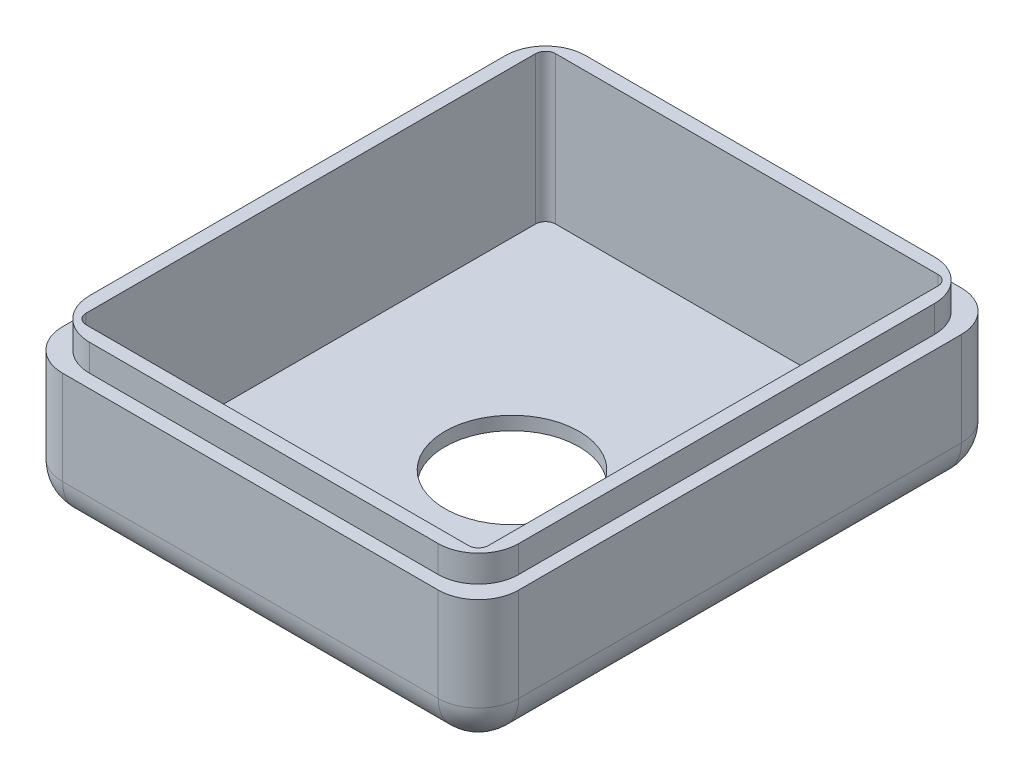
ISO-10303-21;
HEADER;
FILE_DESCRIPTION(('STEP AP214'),'2;1');
FILE_NAME('part.step','',(''),(''),'','','');
FILE_SCHEMA(('AUTOMOTIVE_DESIGN { 1 0 10303 214 1 1 1 1 }'));
ENDSEC;
DATA;
#1=APPLICATION_CONTEXT('core data for automotive mechanical design processes');
#2=APPLICATION_PROTOCOL_DEFINITION('international standard','automotive_design',2000,#1);
#3=PRODUCT_CONTEXT('',#1,'mechanical');
#4=PRODUCT('Part','Part','',(#3));
#5=PRODUCT_RELATED_PRODUCT_CATEGORY('part','',(#4));
#6=PRODUCT_DEFINITION_FORMATION('','',#4);
#7=PRODUCT_DEFINITION_CONTEXT('part definition',#1,'design');
#8=PRODUCT_DEFINITION('design','',#6,#7);
#9=PRODUCT_DEFINITION_SHAPE('','',#8);
#10=(LENGTH_UNIT() NAMED_UNIT(*) SI_UNIT(.MILLI.,.METRE.));
#11=(NAMED_UNIT(*) PLANE_ANGLE_UNIT() SI_UNIT($,.RADIAN.));
#12=(NAMED_UNIT(*) SI_UNIT($,.STERADIAN.) SOLID_ANGLE_UNIT());
#13=UNCERTAINTY_MEASURE_WITH_UNIT(LENGTH_MEASURE(1.E-05),#10,'distance_accuracy_value','');
#14=(GEOMETRIC_REPRESENTATION_CONTEXT(3) GLOBAL_UNCERTAINTY_ASSIGNED_CONTEXT((#13)) GLOBAL_UNIT_ASSIGNED_CONTEXT((#10,
#11,#12)) REPRESENTATION_CONTEXT('',''));
#15=CARTESIAN_POINT('',(0.,0.,0.));
#16=DIRECTION('',(0.,0.,1.));
#17=DIRECTION('',(1.,0.,0.));
#18=AXIS2_PLACEMENT_3D('',#15,#16,#17);
#19=CARTESIAN_POINT('',(0.,10.,0.));
#20=DIRECTION('',(0.,1.,0.));
#21=DIRECTION('',(0.,0.,1.));
#22=AXIS2_PLACEMENT_3D('',#19,#20,#21);
#23=PLANE('',#22);
#24=DIRECTION('',(0.,0.,1.));
#25=VECTOR('',#24,1.);
#26=CARTESIAN_POINT('',(-33.3060071716871,10.,-9.81740921165118));
#27=LINE('',#26,#25);
#28=CARTESIAN_POINT('',(-33.3060071716871,10.,-6.81740921165118));
#29=VERTEX_POINT('',#28);
#30=CARTESIAN_POINT('',(-33.3060071716871,10.,26.1825907883488));
#31=VERTEX_POINT('',#30);
#32=EDGE_CURVE('E246',#29,#31,#27,.T.);
#33=ORIENTED_EDGE('',*,*,#32,.T.);
#34=CARTESIAN_POINT('',(-30.3060071716871,10.,26.1825907883488));
#35=DIRECTION('',(0.,1.,0.));
#36=DIRECTION('',(0.,0.,1.));
#37=AXIS2_PLACEMENT_3D('',#34,#35,#36);
#38=CIRCLE('',#37,3.);
#39=CARTESIAN_POINT('',(-30.3060071716871,10.,29.1825907883488));
#40=VERTEX_POINT('',#39);
#41=EDGE_CURVE('E220',#31,#40,#38,.T.);
#42=ORIENTED_EDGE('',*,*,#41,.T.);
#43=DIRECTION('',(1.,0.,0.));
#44=VECTOR('',#43,1.);
#45=CARTESIAN_POINT('',(-33.3060071716871,10.,29.1825907883488));
#46=LINE('',#45,#44);
#47=CARTESIAN_POINT('',(-2.30600717168713,10.,29.1825907883488));
#48=VERTEX_POINT('',#47);
#49=EDGE_CURVE('E249',#40,#48,#46,.T.);
#50=ORIENTED_EDGE('',*,*,#49,.T.);
#51=CARTESIAN_POINT('',(-2.30600717168713,10.,26.1825907883488));
#52=DIRECTION('',(0.,1.,0.));
#53=DIRECTION('',(0.,0.,1.));
#54=AXIS2_PLACEMENT_3D('',#51,#52,#53);
#55=CIRCLE('',#54,3.);
#56=CARTESIAN_POINT('',(0.693992828312874,10.,26.1825907883488));
#57=VERTEX_POINT('',#56);
#58=EDGE_CURVE('E318',#48,#57,#55,.T.);
#59=ORIENTED_EDGE('',*,*,#58,.T.);
#60=DIRECTION('',(0.,0.,-1.));
#61=VECTOR('',#60,1.);
#62=CARTESIAN_POINT('',(0.693992828312867,10.,-9.81740921165118));
#63=LINE('',#62,#61);
#64=CARTESIAN_POINT('',(0.693992828312868,10.,-6.81740921165118));
#65=VERTEX_POINT('',#64);
#66=EDGE_CURVE('E252',#57,#65,#63,.T.);
#67=ORIENTED_EDGE('',*,*,#66,.T.);
#68=CARTESIAN_POINT('',(-2.30600717168713,10.,-6.81740921165118));
#69=DIRECTION('',(0.,1.,0.));
#70=DIRECTION('',(0.,0.,1.));
#71=AXIS2_PLACEMENT_3D('',#68,#69,#70);
#72=CIRCLE('',#71,3.);
#73=CARTESIAN_POINT('',(-2.30600717168713,10.,-9.81740921165118));
#74=VERTEX_POINT('',#73);
#75=EDGE_CURVE('E314',#65,#74,#72,.T.);
#76=ORIENTED_EDGE('',*,*,#75,.T.);
#77=DIRECTION('',(-1.,0.,0.));
#78=VECTOR('',#77,1.);
#79=CARTESIAN_POINT('',(-33.3060071716871,10.,-9.81740921165118));
#80=LINE('',#79,#78);
#81=CARTESIAN_POINT('',(-30.3060071716871,10.,-9.81740921165118));
#82=VERTEX_POINT('',#81);
#83=EDGE_CURVE('E255',#74,#82,#80,.T.);
#84=ORIENTED_EDGE('',*,*,#83,.T.);
#85=CARTESIAN_POINT('',(-30.3060071716871,10.,-6.81740921165118));
#86=DIRECTION('',(0.,1.,0.));
#87=DIRECTION('',(0.,0.,1.));
#88=AXIS2_PLACEMENT_3D('',#85,#86,#87);
#89=CIRCLE('',#88,3.);
#90=EDGE_CURVE('E316',#82,#29,#89,.T.);
#91=ORIENTED_EDGE('',*,*,#90,.T.);
#92=EDGE_LOOP('',(#33,#42,#50,#59,#67,#76,#84,#91));
#93=FACE_BOUND('',#92,.T.);
#94=DIRECTION('',(1.,0.,0.));
#95=VECTOR('',#94,1.);
#96=CARTESIAN_POINT('',(-32.3060071716871,10.,28.1825907883488));
#97=LINE('',#96,#95);
#98=CARTESIAN_POINT('',(-29.3060071716871,10.,28.1825907883488));
#99=VERTEX_POINT('',#98);
#100=CARTESIAN_POINT('',(-3.30600717168713,10.,28.1825907883488));
#101=VERTEX_POINT('',#100);
#102=EDGE_CURVE('E242',#99,#101,#97,.T.);
#103=ORIENTED_EDGE('',*,*,#102,.F.);
#104=CARTESIAN_POINT('',(-29.3060071716871,10.,25.1825907883488));
#105=DIRECTION('',(0.,1.,0.));
#106=DIRECTION('',(0.,0.,1.));
#107=AXIS2_PLACEMENT_3D('',#104,#105,#106);
#108=CIRCLE('',#107,3.);
#109=CARTESIAN_POINT('',(-32.3060071716871,10.,25.1825907883488));
#110=VERTEX_POINT('',#109);
#111=EDGE_CURVE('E322',#99,#110,#108,.F.);
#112=ORIENTED_EDGE('',*,*,#111,.T.);
#113=DIRECTION('',(0.,0.,1.));
#114=VECTOR('',#113,1.);
#115=CARTESIAN_POINT('',(-32.3060071716871,10.,28.1825907883488));
#116=LINE('',#115,#114);
#117=CARTESIAN_POINT('',(-32.3060071716871,10.,-5.81740921165118));
#118=VERTEX_POINT('',#117);
#119=EDGE_CURVE('E420',#118,#110,#116,.T.);
#120=ORIENTED_EDGE('',*,*,#119,.F.);
#121=CARTESIAN_POINT('',(-29.3060071716871,10.,-5.81740921165118));
#122=DIRECTION('',(0.,1.,0.));
#123=DIRECTION('',(0.,0.,1.));
#124=AXIS2_PLACEMENT_3D('',#121,#122,#123);
#125=CIRCLE('',#124,3.);
#126=CARTESIAN_POINT('',(-29.3060071716871,10.,-8.81740921165118));
#127=VERTEX_POINT('',#126);
#128=EDGE_CURVE('E235',#118,#127,#125,.F.);
#129=ORIENTED_EDGE('',*,*,#128,.T.);
#130=DIRECTION('',(-1.,0.,0.));
#131=VECTOR('',#130,1.);
#132=CARTESIAN_POINT('',(-32.3060071716871,10.,-8.81740921165118));
#133=LINE('',#132,#131);
#134=CARTESIAN_POINT('',(-3.30600717168713,10.,-8.81740921165118));
#135=VERTEX_POINT('',#134);
#136=EDGE_CURVE('E226',#135,#127,#133,.T.);
#137=ORIENTED_EDGE('',*,*,#136,.F.);
#138=CARTESIAN_POINT('',(-3.30600717168713,10.,-5.81740921165118));
#139=DIRECTION('',(0.,1.,0.));
#140=DIRECTION('',(0.,0.,1.));
#141=AXIS2_PLACEMENT_3D('',#138,#139,#140);
#142=CIRCLE('',#141,3.);
#143=CARTESIAN_POINT('',(-0.306007171687134,10.,-5.81740921165118));
#144=VERTEX_POINT('',#143);
#145=EDGE_CURVE('E209',#135,#144,#142,.F.);
#146=ORIENTED_EDGE('',*,*,#145,.T.);
#147=DIRECTION('',(0.,0.,-1.));
#148=VECTOR('',#147,1.);
#149=CARTESIAN_POINT('',(-0.306007171687134,10.,28.1825907883488));
#150=LINE('',#149,#148);
#151=CARTESIAN_POINT('',(-0.306007171687134,10.,25.1825907883488));
#152=VERTEX_POINT('',#151);
#153=EDGE_CURVE('E237',#152,#144,#150,.T.);
#154=ORIENTED_EDGE('',*,*,#153,.F.);
#155=CARTESIAN_POINT('',(-3.30600717168713,10.,25.1825907883488));
#156=DIRECTION('',(0.,1.,0.));
#157=DIRECTION('',(0.,0.,1.));
#158=AXIS2_PLACEMENT_3D('',#155,#156,#157);
#159=CIRCLE('',#158,3.);
#160=EDGE_CURVE('E219',#152,#101,#159,.F.);
#161=ORIENTED_EDGE('',*,*,#160,.T.);
#162=EDGE_LOOP('',(#103,#112,#120,#129,#137,#146,#154,#161));
#163=FACE_BOUND('',#162,.T.);
#164=ADVANCED_FACE('F37',(#93,#163),#23,.T.);
#165=CARTESIAN_POINT('',(-33.3060071716871,10.,-9.81740921165118));
#166=DIRECTION('',(1.,0.,0.));
#167=DIRECTION('',(0.,0.,-1.));
#168=AXIS2_PLACEMENT_3D('',#165,#166,#167);
#169=PLANE('',#168);
#170=DIRECTION('',(0.,0.,1.));
#171=VECTOR('',#170,1.);
#172=CARTESIAN_POINT('',(-33.3060071716871,3.,-9.81740921165118));
#173=LINE('',#172,#171);
#174=CARTESIAN_POINT('',(-33.3060071716871,3.,-6.81740921165118));
#175=VERTEX_POINT('',#174);
#176=CARTESIAN_POINT('',(-33.3060071716871,3.,26.1825907883488));
#177=VERTEX_POINT('',#176);
#178=EDGE_CURVE('E310',#175,#177,#173,.T.);
#179=ORIENTED_EDGE('',*,*,#178,.T.);
#180=DIRECTION('',(0.,-1.,0.));
#181=VECTOR('',#180,1.);
#182=CARTESIAN_POINT('',(-33.3060071716871,10.,26.1825907883488));
#183=LINE('',#182,#181);
#184=EDGE_CURVE('E312',#177,#31,#183,.F.);
#185=ORIENTED_EDGE('',*,*,#184,.T.);
#186=ORIENTED_EDGE('',*,*,#32,.F.);
#187=DIRECTION('',(0.,-1.,0.));
#188=VECTOR('',#187,1.);
#189=CARTESIAN_POINT('',(-33.3060071716871,10.,-6.81740921165118));
#190=LINE('',#189,#188);
#191=EDGE_CURVE('E308',#29,#175,#190,.T.);
#192=ORIENTED_EDGE('',*,*,#191,.T.);
#193=EDGE_LOOP('',(#179,#185,#186,#192));
#194=FACE_BOUND('',#193,.T.);
#195=ADVANCED_FACE('F461',(#194),#169,.F.);
#196=CARTESIAN_POINT('',(-33.3060071716871,10.,29.1825907883488));
#197=DIRECTION('',(0.,0.,-1.));
#198=DIRECTION('',(-1.,0.,0.));
#199=AXIS2_PLACEMENT_3D('',#196,#197,#198);
#200=PLANE('',#199);
#201=ORIENTED_EDGE('',*,*,#49,.F.);
#202=DIRECTION('',(0.,-1.,0.));
#203=VECTOR('',#202,1.);
#204=CARTESIAN_POINT('',(-30.3060071716871,10.,29.1825907883488));
#205=LINE('',#204,#203);
#206=CARTESIAN_POINT('',(-30.3060071716871,3.,29.1825907883488));
#207=VERTEX_POINT('',#206);
#208=EDGE_CURVE('E285',#40,#207,#205,.T.);
#209=ORIENTED_EDGE('',*,*,#208,.T.);
#210=DIRECTION('',(1.,0.,0.));
#211=VECTOR('',#210,1.);
#212=CARTESIAN_POINT('',(-33.3060071716871,3.,29.1825907883488));
#213=LINE('',#212,#211);
#214=CARTESIAN_POINT('',(-2.30600717168713,3.,29.1825907883488));
#215=VERTEX_POINT('',#214);
#216=EDGE_CURVE('E282',#207,#215,#213,.T.);
#217=ORIENTED_EDGE('',*,*,#216,.T.);
#218=DIRECTION('',(0.,-1.,0.));
#219=VECTOR('',#218,1.);
#220=CARTESIAN_POINT('',(-2.30600717168713,10.,29.1825907883488));
#221=LINE('',#220,#219);
#222=EDGE_CURVE('E280',#215,#48,#221,.F.);
#223=ORIENTED_EDGE('',*,*,#222,.T.);
#224=EDGE_LOOP('',(#201,#209,#217,#223));
#225=FACE_BOUND('',#224,.T.);
#226=ADVANCED_FACE('F467',(#225),#200,.F.);
#227=CARTESIAN_POINT('',(0.693992828312867,10.,-9.81740921165118));
#228=DIRECTION('',(-1.,0.,0.));
#229=DIRECTION('',(0.,0.,1.));
#230=AXIS2_PLACEMENT_3D('',#227,#228,#229);
#231=PLANE('',#230);
#232=ORIENTED_EDGE('',*,*,#66,.F.);
#233=DIRECTION('',(0.,-1.,0.));
#234=VECTOR('',#233,1.);
#235=CARTESIAN_POINT('',(0.693992828312874,10.,26.1825907883488));
#236=LINE('',#235,#234);
#237=CARTESIAN_POINT('',(0.693992828312874,3.,26.1825907883488));
#238=VERTEX_POINT('',#237);
#239=EDGE_CURVE('E300',#57,#238,#236,.T.);
#240=ORIENTED_EDGE('',*,*,#239,.T.);
#241=DIRECTION('',(0.,0.,-1.));
#242=VECTOR('',#241,1.);
#243=CARTESIAN_POINT('',(0.693992828312867,3.,-9.81740921165118));
#244=LINE('',#243,#242);
#245=CARTESIAN_POINT('',(0.693992828312868,3.,-6.81740921165118));
#246=VERTEX_POINT('',#245);
#247=EDGE_CURVE('E298',#238,#246,#244,.T.);
#248=ORIENTED_EDGE('',*,*,#247,.T.);
#249=DIRECTION('',(0.,-1.,0.));
#250=VECTOR('',#249,1.);
#251=CARTESIAN_POINT('',(0.693992828312868,10.,-6.81740921165118));
#252=LINE('',#251,#250);
#253=EDGE_CURVE('E296',#246,#65,#252,.F.);
#254=ORIENTED_EDGE('',*,*,#253,.T.);
#255=EDGE_LOOP('',(#232,#240,#248,#254));
#256=FACE_BOUND('',#255,.T.);
#257=ADVANCED_FACE('F479',(#256),#231,.F.);
#258=CARTESIAN_POINT('',(-33.3060071716871,10.,-9.81740921165118));
#259=DIRECTION('',(0.,0.,1.));
#260=DIRECTION('',(1.,0.,0.));
#261=AXIS2_PLACEMENT_3D('',#258,#259,#260);
#262=PLANE('',#261);
#263=DIRECTION('',(-1.,0.,0.));
#264=VECTOR('',#263,1.);
#265=CARTESIAN_POINT('',(-33.3060071716871,3.,-9.81740921165118));
#266=LINE('',#265,#264);
#267=CARTESIAN_POINT('',(-2.30600717168713,3.,-9.81740921165118));
#268=VERTEX_POINT('',#267);
#269=CARTESIAN_POINT('',(-30.3060071716871,3.,-9.81740921165118));
#270=VERTEX_POINT('',#269);
#271=EDGE_CURVE('E304',#268,#270,#266,.T.);
#272=ORIENTED_EDGE('',*,*,#271,.T.);
#273=DIRECTION('',(0.,-1.,0.));
#274=VECTOR('',#273,1.);
#275=CARTESIAN_POINT('',(-30.3060071716871,10.,-9.81740921165118));
#276=LINE('',#275,#274);
#277=EDGE_CURVE('E306',#270,#82,#276,.F.);
#278=ORIENTED_EDGE('',*,*,#277,.T.);
#279=ORIENTED_EDGE('',*,*,#83,.F.);
#280=DIRECTION('',(0.,-1.,0.));
#281=VECTOR('',#280,1.);
#282=CARTESIAN_POINT('',(-2.30600717168713,10.,-9.81740921165118));
#283=LINE('',#282,#281);
#284=EDGE_CURVE('E302',#74,#268,#283,.T.);
#285=ORIENTED_EDGE('',*,*,#284,.T.);
#286=EDGE_LOOP('',(#272,#278,#279,#285));
#287=FACE_BOUND('',#286,.T.);
#288=ADVANCED_FACE('F475',(#287),#262,.F.);
#289=CARTESIAN_POINT('',(0.,0.,0.));
#290=DIRECTION('',(0.,1.,0.));
#291=DIRECTION('',(0.,0.,1.));
#292=AXIS2_PLACEMENT_3D('',#289,#290,#291);
#293=PLANE('',#292);
#294=CARTESIAN_POINT('',(-16.3060071716871,0.,9.68259078834882));
#295=DIRECTION('',(0.,-1.,0.));
#296=DIRECTION('',(0.,0.,-1.));
#297=AXIS2_PLACEMENT_3D('',#294,#295,#296);
#298=CIRCLE('',#297,5.);
#299=CARTESIAN_POINT('',(-16.3060071716871,0.,4.68259078834882));
#300=VERTEX_POINT('',#299);
#301=EDGE_CURVE('E570',#300,#300,#298,.T.);
#302=ORIENTED_EDGE('',*,*,#301,.F.);
#303=EDGE_LOOP('',(#302));
#304=FACE_BOUND('',#303,.T.);
#305=DIRECTION('',(0.,0.,-1.));
#306=VECTOR('',#305,1.);
#307=CARTESIAN_POINT('',(-2.30600717168713,0.,0.));
#308=LINE('',#307,#306);
#309=CARTESIAN_POINT('',(-2.30600717168713,0.,-6.81740921165118));
#310=VERTEX_POINT('',#309);
#311=CARTESIAN_POINT('',(-2.30600717168713,0.,26.1825907883488));
#312=VERTEX_POINT('',#311);
#313=EDGE_CURVE('E291',#310,#312,#308,.F.);
#314=ORIENTED_EDGE('',*,*,#313,.T.);
#315=DIRECTION('',(1.,0.,0.));
#316=VECTOR('',#315,1.);
#317=CARTESIAN_POINT('',(0.,0.,26.1825907883488));
#318=LINE('',#317,#316);
#319=CARTESIAN_POINT('',(-30.3060071716871,0.,26.1825907883488));
#320=VERTEX_POINT('',#319);
#321=EDGE_CURVE('E293',#312,#320,#318,.F.);
#322=ORIENTED_EDGE('',*,*,#321,.T.);
#323=DIRECTION('',(0.,0.,1.));
#324=VECTOR('',#323,1.);
#325=CARTESIAN_POINT('',(-30.3060071716871,0.,0.));
#326=LINE('',#325,#324);
#327=CARTESIAN_POINT('',(-30.3060071716871,0.,-6.81740921165118));
#328=VERTEX_POINT('',#327);
#329=EDGE_CURVE('E287',#320,#328,#326,.F.);
#330=ORIENTED_EDGE('',*,*,#329,.T.);
#331=DIRECTION('',(-1.,0.,0.));
#332=VECTOR('',#331,1.);
#333=CARTESIAN_POINT('',(0.,0.,-6.81740921165118));
#334=LINE('',#333,#332);
#335=EDGE_CURVE('E289',#328,#310,#334,.F.);
#336=ORIENTED_EDGE('',*,*,#335,.T.);
#337=EDGE_LOOP('',(#314,#322,#330,#336));
#338=FACE_BOUND('',#337,.T.);
#339=ADVANCED_FACE('F472',(#304,#338),#293,.F.);
#340=CARTESIAN_POINT('',(-32.3060071716871,12.,28.1825907883488));
#341=DIRECTION('',(1.,0.,0.));
#342=DIRECTION('',(0.,0.,-1.));
#343=AXIS2_PLACEMENT_3D('',#340,#341,#342);
#344=PLANE('',#343);
#345=ORIENTED_EDGE('',*,*,#119,.T.);
#346=DIRECTION('',(0.,-1.,0.));
#347=VECTOR('',#346,1.);
#348=CARTESIAN_POINT('',(-32.3060071716871,12.,25.1825907883488));
#349=LINE('',#348,#347);
#350=CARTESIAN_POINT('',(-32.3060071716871,12.,25.1825907883488));
#351=VERTEX_POINT('',#350);
#352=EDGE_CURVE('E278',#110,#351,#349,.F.);
#353=ORIENTED_EDGE('',*,*,#352,.T.);
#354=DIRECTION('',(0.,0.,1.));
#355=VECTOR('',#354,1.);
#356=CARTESIAN_POINT('',(-32.3060071716871,12.,28.1825907883488));
#357=LINE('',#356,#355);
#358=CARTESIAN_POINT('',(-32.3060071716871,12.,-5.81740921165118));
#359=VERTEX_POINT('',#358);
#360=EDGE_CURVE('E236',#359,#351,#357,.T.);
#361=ORIENTED_EDGE('',*,*,#360,.F.);
#362=DIRECTION('',(0.,-1.,0.));
#363=VECTOR('',#362,1.);
#364=CARTESIAN_POINT('',(-32.3060071716871,12.,-5.81740921165118));
#365=LINE('',#364,#363);
#366=EDGE_CURVE('E275',#359,#118,#365,.T.);
#367=ORIENTED_EDGE('',*,*,#366,.T.);
#368=EDGE_LOOP('',(#345,#353,#361,#367));
#369=FACE_BOUND('',#368,.T.);
#370=ADVANCED_FACE('F458',(#369),#344,.F.);
#371=CARTESIAN_POINT('',(-32.3060071716871,12.,28.1825907883488));
#372=DIRECTION('',(0.,0.,-1.));
#373=DIRECTION('',(-1.,0.,0.));
#374=AXIS2_PLACEMENT_3D('',#371,#372,#373);
#375=PLANE('',#374);
#376=ORIENTED_EDGE('',*,*,#102,.T.);
#377=DIRECTION('',(0.,-1.,0.));
#378=VECTOR('',#377,1.);
#379=CARTESIAN_POINT('',(-3.30600717168713,12.,28.1825907883488));
#380=LINE('',#379,#378);
#381=CARTESIAN_POINT('',(-3.30600717168713,12.,28.1825907883488));
#382=VERTEX_POINT('',#381);
#383=EDGE_CURVE('E273',#101,#382,#380,.F.);
#384=ORIENTED_EDGE('',*,*,#383,.T.);
#385=DIRECTION('',(1.,0.,0.));
#386=VECTOR('',#385,1.);
#387=CARTESIAN_POINT('',(-32.3060071716871,12.,28.1825907883488));
#388=LINE('',#387,#386);
#389=CARTESIAN_POINT('',(-29.3060071716871,12.,28.1825907883488));
#390=VERTEX_POINT('',#389);
#391=EDGE_CURVE('E240',#390,#382,#388,.T.);
#392=ORIENTED_EDGE('',*,*,#391,.F.);
#393=DIRECTION('',(0.,-1.,0.));
#394=VECTOR('',#393,1.);
#395=CARTESIAN_POINT('',(-29.3060071716871,12.,28.1825907883488));
#396=LINE('',#395,#394);
#397=EDGE_CURVE('E270',#390,#99,#396,.T.);
#398=ORIENTED_EDGE('',*,*,#397,.T.);
#399=EDGE_LOOP('',(#376,#384,#392,#398));
#400=FACE_BOUND('',#399,.T.);
#401=ADVANCED_FACE('F441',(#400),#375,.F.);
#402=CARTESIAN_POINT('',(-0.306007171687134,12.,28.1825907883488));
#403=DIRECTION('',(-1.,0.,0.));
#404=DIRECTION('',(0.,0.,1.));
#405=AXIS2_PLACEMENT_3D('',#402,#403,#404);
#406=PLANE('',#405);
#407=ORIENTED_EDGE('',*,*,#153,.T.);
#408=DIRECTION('',(0.,-1.,0.));
#409=VECTOR('',#408,1.);
#410=CARTESIAN_POINT('',(-0.306007171687134,12.,-5.81740921165118));
#411=LINE('',#410,#409);
#412=CARTESIAN_POINT('',(-0.306007171687134,12.,-5.81740921165118));
#413=VERTEX_POINT('',#412);
#414=EDGE_CURVE('E214',#144,#413,#411,.F.);
#415=ORIENTED_EDGE('',*,*,#414,.T.);
#416=DIRECTION('',(0.,0.,-1.));
#417=VECTOR('',#416,1.);
#418=CARTESIAN_POINT('',(-0.306007171687134,12.,28.1825907883488));
#419=LINE('',#418,#417);
#420=CARTESIAN_POINT('',(-0.306007171687134,12.,25.1825907883488));
#421=VERTEX_POINT('',#420);
#422=EDGE_CURVE('E435',#421,#413,#419,.T.);
#423=ORIENTED_EDGE('',*,*,#422,.F.);
#424=DIRECTION('',(0.,-1.,0.));
#425=VECTOR('',#424,1.);
#426=CARTESIAN_POINT('',(-0.306007171687134,12.,25.1825907883488));
#427=LINE('',#426,#425);
#428=EDGE_CURVE('E230',#421,#152,#427,.T.);
#429=ORIENTED_EDGE('',*,*,#428,.T.);
#430=EDGE_LOOP('',(#407,#415,#423,#429));
#431=FACE_BOUND('',#430,.T.);
#432=ADVANCED_FACE('F450',(#431),#406,.F.);
#433=CARTESIAN_POINT('',(-32.3060071716871,12.,-8.81740921165118));
#434=DIRECTION('',(0.,0.,1.));
#435=DIRECTION('',(1.,0.,0.));
#436=AXIS2_PLACEMENT_3D('',#433,#434,#435);
#437=PLANE('',#436);
#438=DIRECTION('',(-1.,0.,0.));
#439=VECTOR('',#438,1.);
#440=CARTESIAN_POINT('',(-32.3060071716871,12.,-8.81740921165118));
#441=LINE('',#440,#439);
#442=CARTESIAN_POINT('',(-3.30600717168713,12.,-8.81740921165118));
#443=VERTEX_POINT('',#442);
#444=CARTESIAN_POINT('',(-29.3060071716871,12.,-8.81740921165118));
#445=VERTEX_POINT('',#444);
#446=EDGE_CURVE('E229',#443,#445,#441,.T.);
#447=ORIENTED_EDGE('',*,*,#446,.F.);
#448=DIRECTION('',(0.,-1.,0.));
#449=VECTOR('',#448,1.);
#450=CARTESIAN_POINT('',(-3.30600717168713,12.,-8.81740921165118));
#451=LINE('',#450,#449);
#452=EDGE_CURVE('E213',#443,#135,#451,.T.);
#453=ORIENTED_EDGE('',*,*,#452,.T.);
#454=ORIENTED_EDGE('',*,*,#136,.T.);
#455=DIRECTION('',(0.,-1.,0.));
#456=VECTOR('',#455,1.);
#457=CARTESIAN_POINT('',(-29.3060071716871,12.,-8.81740921165118));
#458=LINE('',#457,#456);
#459=EDGE_CURVE('E231',#127,#445,#458,.F.);
#460=ORIENTED_EDGE('',*,*,#459,.T.);
#461=EDGE_LOOP('',(#447,#453,#454,#460));
#462=FACE_BOUND('',#461,.T.);
#463=ADVANCED_FACE('F225',(#462),#437,.F.);
#464=CARTESIAN_POINT('',(0.,12.,0.));
#465=DIRECTION('',(0.,-1.,0.));
#466=DIRECTION('',(0.,0.,-1.));
#467=AXIS2_PLACEMENT_3D('',#464,#465,#466);
#468=PLANE('',#467);
#469=DIRECTION('',(1.,0.,0.));
#470=VECTOR('',#469,1.);
#471=CARTESIAN_POINT('',(-31.3060071716871,12.,27.1825907883488));
#472=LINE('',#471,#470);
#473=CARTESIAN_POINT('',(-30.5560071716871,12.,27.1825907883488));
#474=VERTEX_POINT('',#473);
#475=CARTESIAN_POINT('',(-2.05600717168713,12.,27.1825907883488));
#476=VERTEX_POINT('',#475);
#477=EDGE_CURVE('E406',#474,#476,#472,.T.);
#478=ORIENTED_EDGE('',*,*,#477,.F.);
#479=CARTESIAN_POINT('',(-30.5560071716871,12.,26.4325907883488));
#480=DIRECTION('',(0.,-1.,0.));
#481=DIRECTION('',(0.,0.,-1.));
#482=AXIS2_PLACEMENT_3D('',#479,#480,#481);
#483=CIRCLE('',#482,0.75);
#484=CARTESIAN_POINT('',(-31.3060071716871,12.,26.4325907883488));
#485=VERTEX_POINT('',#484);
#486=EDGE_CURVE('E11',#474,#485,#483,.T.);
#487=ORIENTED_EDGE('',*,*,#486,.T.);
#488=DIRECTION('',(0.,0.,1.));
#489=VECTOR('',#488,1.);
#490=CARTESIAN_POINT('',(-31.3060071716871,12.,27.1825907883488));
#491=LINE('',#490,#489);
#492=CARTESIAN_POINT('',(-31.3060071716871,12.,-7.06740921165119));
#493=VERTEX_POINT('',#492);
#494=EDGE_CURVE('E361',#493,#485,#491,.T.);
#495=ORIENTED_EDGE('',*,*,#494,.F.);
#496=CARTESIAN_POINT('',(-30.5560071716871,12.,-7.06740921165119));
#497=DIRECTION('',(0.,-1.,0.));
#498=DIRECTION('',(0.,0.,-1.));
#499=AXIS2_PLACEMENT_3D('',#496,#497,#498);
#500=CIRCLE('',#499,0.75);
#501=CARTESIAN_POINT('',(-30.5560071716871,12.,-7.81740921165119));
#502=VERTEX_POINT('',#501);
#503=EDGE_CURVE('E388',#493,#502,#500,.T.);
#504=ORIENTED_EDGE('',*,*,#503,.T.);
#505=DIRECTION('',(-1.,0.,0.));
#506=VECTOR('',#505,1.);
#507=CARTESIAN_POINT('',(-31.3060071716871,12.,-7.81740921165119));
#508=LINE('',#507,#506);
#509=CARTESIAN_POINT('',(-2.05600717168713,12.,-7.81740921165119));
#510=VERTEX_POINT('',#509);
#511=EDGE_CURVE('E397',#510,#502,#508,.T.);
#512=ORIENTED_EDGE('',*,*,#511,.F.);
#513=CARTESIAN_POINT('',(-2.05600717168713,12.,-7.06740921165119));
#514=DIRECTION('',(0.,-1.,0.));
#515=DIRECTION('',(0.,0.,-1.));
#516=AXIS2_PLACEMENT_3D('',#513,#514,#515);
#517=CIRCLE('',#516,0.75);
#518=CARTESIAN_POINT('',(-1.30600717168713,12.,-7.06740921165119));
#519=VERTEX_POINT('',#518);
#520=EDGE_CURVE('E390',#510,#519,#517,.T.);
#521=ORIENTED_EDGE('',*,*,#520,.T.);
#522=DIRECTION('',(0.,0.,-1.));
#523=VECTOR('',#522,1.);
#524=CARTESIAN_POINT('',(-1.30600717168713,12.,27.1825907883488));
#525=LINE('',#524,#523);
#526=CARTESIAN_POINT('',(-1.30600717168713,12.,26.4325907883488));
#527=VERTEX_POINT('',#526);
#528=EDGE_CURVE('E395',#527,#519,#525,.T.);
#529=ORIENTED_EDGE('',*,*,#528,.F.);
#530=CARTESIAN_POINT('',(-2.05600717168713,12.,26.4325907883488));
#531=DIRECTION('',(0.,-1.,0.));
#532=DIRECTION('',(0.,0.,-1.));
#533=AXIS2_PLACEMENT_3D('',#530,#531,#532);
#534=CIRCLE('',#533,0.75);
#535=EDGE_CURVE('E45',#527,#476,#534,.T.);
#536=ORIENTED_EDGE('',*,*,#535,.T.);
#537=EDGE_LOOP('',(#478,#487,#495,#504,#512,#521,#529,#536));
#538=FACE_BOUND('',#537,.T.);
#539=ORIENTED_EDGE('',*,*,#422,.T.);
#540=CARTESIAN_POINT('',(-3.30600717168713,12.,-5.81740921165118));
#541=DIRECTION('',(0.,-1.,0.));
#542=DIRECTION('',(0.,0.,-1.));
#543=AXIS2_PLACEMENT_3D('',#540,#541,#542);
#544=CIRCLE('',#543,3.);
#545=EDGE_CURVE('E268',#413,#443,#544,.F.);
#546=ORIENTED_EDGE('',*,*,#545,.T.);
#547=ORIENTED_EDGE('',*,*,#446,.T.);
#548=CARTESIAN_POINT('',(-29.3060071716871,12.,-5.81740921165118));
#549=DIRECTION('',(0.,-1.,0.));
#550=DIRECTION('',(0.,0.,-1.));
#551=AXIS2_PLACEMENT_3D('',#548,#549,#550);
#552=CIRCLE('',#551,3.);
#553=EDGE_CURVE('E262',#445,#359,#552,.F.);
#554=ORIENTED_EDGE('',*,*,#553,.T.);
#555=ORIENTED_EDGE('',*,*,#360,.T.);
#556=CARTESIAN_POINT('',(-29.3060071716871,12.,25.1825907883488));
#557=DIRECTION('',(0.,-1.,0.));
#558=DIRECTION('',(0.,0.,-1.));
#559=AXIS2_PLACEMENT_3D('',#556,#557,#558);
#560=CIRCLE('',#559,3.);
#561=EDGE_CURVE('E264',#351,#390,#560,.F.);
#562=ORIENTED_EDGE('',*,*,#561,.T.);
#563=ORIENTED_EDGE('',*,*,#391,.T.);
#564=CARTESIAN_POINT('',(-3.30600717168713,12.,25.1825907883488));
#565=DIRECTION('',(0.,-1.,0.));
#566=DIRECTION('',(0.,0.,-1.));
#567=AXIS2_PLACEMENT_3D('',#564,#565,#566);
#568=CIRCLE('',#567,3.);
#569=EDGE_CURVE('E266',#382,#421,#568,.F.);
#570=ORIENTED_EDGE('',*,*,#569,.T.);
#571=EDGE_LOOP('',(#539,#546,#547,#554,#555,#562,#563,#570));
#572=FACE_BOUND('',#571,.T.);
#573=ADVANCED_FACE('F393',(#538,#572),#468,.F.);
#574=CARTESIAN_POINT('',(-31.3060071716871,1.,27.1825907883488));
#575=DIRECTION('',(-1.,0.,0.));
#576=DIRECTION('',(0.,0.,1.));
#577=AXIS2_PLACEMENT_3D('',#574,#575,#576);
#578=PLANE('',#577);
#579=DIRECTION('',(0.,0.,1.));
#580=VECTOR('',#579,1.);
#581=CARTESIAN_POINT('',(-31.3060071716871,1.,27.1825907883488));
#582=LINE('',#581,#580);
#583=CARTESIAN_POINT('',(-31.3060071716871,1.,-7.06740921165119));
#584=VERTEX_POINT('',#583);
#585=CARTESIAN_POINT('',(-31.3060071716871,1.,26.4325907883488));
#586=VERTEX_POINT('',#585);
#587=EDGE_CURVE('E431',#584,#586,#582,.T.);
#588=ORIENTED_EDGE('',*,*,#587,.F.);
#589=DIRECTION('',(0.,1.,0.));
#590=VECTOR('',#589,1.);
#591=CARTESIAN_POINT('',(-31.3060071716871,12.,-7.06740921165119));
#592=LINE('',#591,#590);
#593=EDGE_CURVE('E363',#584,#493,#592,.T.);
#594=ORIENTED_EDGE('',*,*,#593,.T.);
#595=ORIENTED_EDGE('',*,*,#494,.T.);
#596=DIRECTION('',(0.,1.,0.));
#597=VECTOR('',#596,1.);
#598=CARTESIAN_POINT('',(-31.3060071716871,1.,26.4325907883488));
#599=LINE('',#598,#597);
#600=EDGE_CURVE('E325',#485,#586,#599,.F.);
#601=ORIENTED_EDGE('',*,*,#600,.T.);
#602=EDGE_LOOP('',(#588,#594,#595,#601));
#603=FACE_BOUND('',#602,.T.);
#604=ADVANCED_FACE('F627',(#603),#578,.F.);
#605=CARTESIAN_POINT('',(-31.3060071716871,1.,-7.81740921165119));
#606=DIRECTION('',(0.,0.,-1.));
#607=DIRECTION('',(-1.,0.,0.));
#608=AXIS2_PLACEMENT_3D('',#605,#606,#607);
#609=PLANE('',#608);
#610=ORIENTED_EDGE('',*,*,#511,.T.);
#611=DIRECTION('',(0.,1.,0.));
#612=VECTOR('',#611,1.);
#613=CARTESIAN_POINT('',(-30.5560071716871,1.,-7.81740921165119));
#614=LINE('',#613,#612);
#615=CARTESIAN_POINT('',(-30.5560071716871,1.,-7.81740921165119));
#616=VERTEX_POINT('',#615);
#617=EDGE_CURVE('E369',#502,#616,#614,.F.);
#618=ORIENTED_EDGE('',*,*,#617,.T.);
#619=DIRECTION('',(-1.,0.,0.));
#620=VECTOR('',#619,1.);
#621=CARTESIAN_POINT('',(-31.3060071716871,1.,-7.81740921165119));
#622=LINE('',#621,#620);
#623=CARTESIAN_POINT('',(-2.05600717168713,1.,-7.81740921165119));
#624=VERTEX_POINT('',#623);
#625=EDGE_CURVE('E414',#624,#616,#622,.T.);
#626=ORIENTED_EDGE('',*,*,#625,.F.);
#627=DIRECTION('',(0.,1.,0.));
#628=VECTOR('',#627,1.);
#629=CARTESIAN_POINT('',(-2.05600717168713,12.,-7.81740921165119));
#630=LINE('',#629,#628);
#631=EDGE_CURVE('E366',#624,#510,#630,.T.);
#632=ORIENTED_EDGE('',*,*,#631,.T.);
#633=EDGE_LOOP('',(#610,#618,#626,#632));
#634=FACE_BOUND('',#633,.T.);
#635=ADVANCED_FACE('F418',(#634),#609,.F.);
#636=CARTESIAN_POINT('',(-1.30600717168713,1.,27.1825907883488));
#637=DIRECTION('',(1.,0.,0.));
#638=DIRECTION('',(0.,0.,-1.));
#639=AXIS2_PLACEMENT_3D('',#636,#637,#638);
#640=PLANE('',#639);
#641=ORIENTED_EDGE('',*,*,#528,.T.);
#642=DIRECTION('',(0.,1.,0.));
#643=VECTOR('',#642,1.);
#644=CARTESIAN_POINT('',(-1.30600717168713,1.,-7.06740921165119));
#645=LINE('',#644,#643);
#646=CARTESIAN_POINT('',(-1.30600717168713,1.,-7.06740921165119));
#647=VERTEX_POINT('',#646);
#648=EDGE_CURVE('E382',#519,#647,#645,.F.);
#649=ORIENTED_EDGE('',*,*,#648,.T.);
#650=DIRECTION('',(0.,0.,-1.));
#651=VECTOR('',#650,1.);
#652=CARTESIAN_POINT('',(-1.30600717168713,1.,27.1825907883488));
#653=LINE('',#652,#651);
#654=CARTESIAN_POINT('',(-1.30600717168713,1.,26.4325907883488));
#655=VERTEX_POINT('',#654);
#656=EDGE_CURVE('E416',#655,#647,#653,.T.);
#657=ORIENTED_EDGE('',*,*,#656,.F.);
#658=DIRECTION('',(0.,1.,0.));
#659=VECTOR('',#658,1.);
#660=CARTESIAN_POINT('',(-1.30600717168713,12.,26.4325907883488));
#661=LINE('',#660,#659);
#662=EDGE_CURVE('E379',#655,#527,#661,.T.);
#663=ORIENTED_EDGE('',*,*,#662,.T.);
#664=EDGE_LOOP('',(#641,#649,#657,#663));
#665=FACE_BOUND('',#664,.T.);
#666=ADVANCED_FACE('F402',(#665),#640,.F.);
#667=CARTESIAN_POINT('',(-31.3060071716871,1.,27.1825907883488));
#668=DIRECTION('',(0.,0.,1.));
#669=DIRECTION('',(1.,0.,0.));
#670=AXIS2_PLACEMENT_3D('',#667,#668,#669);
#671=PLANE('',#670);
#672=ORIENTED_EDGE('',*,*,#477,.T.);
#673=DIRECTION('',(0.,1.,0.));
#674=VECTOR('',#673,1.);
#675=CARTESIAN_POINT('',(-2.05600717168713,1.,27.1825907883488));
#676=LINE('',#675,#674);
#677=CARTESIAN_POINT('',(-2.05600717168713,1.,27.1825907883488));
#678=VERTEX_POINT('',#677);
#679=EDGE_CURVE('E386',#476,#678,#676,.F.);
#680=ORIENTED_EDGE('',*,*,#679,.T.);
#681=DIRECTION('',(1.,0.,0.));
#682=VECTOR('',#681,1.);
#683=CARTESIAN_POINT('',(-31.3060071716871,1.,27.1825907883488));
#684=LINE('',#683,#682);
#685=CARTESIAN_POINT('',(-30.5560071716871,1.,27.1825907883488));
#686=VERTEX_POINT('',#685);
#687=EDGE_CURVE('E424',#686,#678,#684,.T.);
#688=ORIENTED_EDGE('',*,*,#687,.F.);
#689=DIRECTION('',(0.,1.,0.));
#690=VECTOR('',#689,1.);
#691=CARTESIAN_POINT('',(-30.5560071716871,12.,27.1825907883488));
#692=LINE('',#691,#690);
#693=EDGE_CURVE('E384',#686,#474,#692,.T.);
#694=ORIENTED_EDGE('',*,*,#693,.T.);
#695=EDGE_LOOP('',(#672,#680,#688,#694));
#696=FACE_BOUND('',#695,.T.);
#697=ADVANCED_FACE('F617',(#696),#671,.F.);
#698=CARTESIAN_POINT('',(0.,1.,0.));
#699=DIRECTION('',(0.,-1.,0.));
#700=DIRECTION('',(0.,0.,-1.));
#701=AXIS2_PLACEMENT_3D('',#698,#699,#700);
#702=PLANE('',#701);
#703=CARTESIAN_POINT('',(-16.3060071716871,1.,9.68259078834882));
#704=DIRECTION('',(0.,-1.,0.));
#705=DIRECTION('',(0.,0.,-1.));
#706=AXIS2_PLACEMENT_3D('',#703,#704,#705);
#707=CIRCLE('',#706,5.);
#708=CARTESIAN_POINT('',(-16.3060071716871,1.,4.68259078834882));
#709=VERTEX_POINT('',#708);
#710=EDGE_CURVE('E329',#709,#709,#707,.F.);
#711=ORIENTED_EDGE('',*,*,#710,.F.);
#712=EDGE_LOOP('',(#711));
#713=FACE_BOUND('',#712,.T.);
#714=ORIENTED_EDGE('',*,*,#625,.T.);
#715=CARTESIAN_POINT('',(-30.5560071716871,1.,-7.06740921165119));
#716=DIRECTION('',(0.,-1.,0.));
#717=DIRECTION('',(0.,0.,-1.));
#718=AXIS2_PLACEMENT_3D('',#715,#716,#717);
#719=CIRCLE('',#718,0.75);
#720=EDGE_CURVE('E377',#616,#584,#719,.F.);
#721=ORIENTED_EDGE('',*,*,#720,.T.);
#722=ORIENTED_EDGE('',*,*,#587,.T.);
#723=CARTESIAN_POINT('',(-30.5560071716871,1.,26.4325907883488));
#724=DIRECTION('',(0.,-1.,0.));
#725=DIRECTION('',(0.,0.,-1.));
#726=AXIS2_PLACEMENT_3D('',#723,#724,#725);
#727=CIRCLE('',#726,0.75);
#728=EDGE_CURVE('E371',#586,#686,#727,.F.);
#729=ORIENTED_EDGE('',*,*,#728,.T.);
#730=ORIENTED_EDGE('',*,*,#687,.T.);
#731=CARTESIAN_POINT('',(-2.05600717168713,1.,26.4325907883488));
#732=DIRECTION('',(0.,-1.,0.));
#733=DIRECTION('',(0.,0.,-1.));
#734=AXIS2_PLACEMENT_3D('',#731,#732,#733);
#735=CIRCLE('',#734,0.75);
#736=EDGE_CURVE('E373',#678,#655,#735,.F.);
#737=ORIENTED_EDGE('',*,*,#736,.T.);
#738=ORIENTED_EDGE('',*,*,#656,.T.);
#739=CARTESIAN_POINT('',(-2.05600717168713,1.,-7.06740921165119));
#740=DIRECTION('',(0.,-1.,0.));
#741=DIRECTION('',(0.,0.,-1.));
#742=AXIS2_PLACEMENT_3D('',#739,#740,#741);
#743=CIRCLE('',#742,0.75);
#744=EDGE_CURVE('E375',#647,#624,#743,.F.);
#745=ORIENTED_EDGE('',*,*,#744,.T.);
#746=EDGE_LOOP('',(#714,#721,#722,#729,#730,#737,#738,#745));
#747=FACE_BOUND('',#746,.T.);
#748=ADVANCED_FACE('F413',(#713,#747),#702,.F.);
#749=CARTESIAN_POINT('',(-3.30600717168713,12.,-5.81740921165118));
#750=DIRECTION('',(0.,-1.,0.));
#751=DIRECTION('',(0.,0.,-1.));
#752=AXIS2_PLACEMENT_3D('',#749,#750,#751);
#753=CYLINDRICAL_SURFACE('',#752,3.);
#754=ORIENTED_EDGE('',*,*,#545,.F.);
#755=ORIENTED_EDGE('',*,*,#414,.F.);
#756=ORIENTED_EDGE('',*,*,#145,.F.);
#757=ORIENTED_EDGE('',*,*,#452,.F.);
#758=EDGE_LOOP('',(#754,#755,#756,#757));
#759=FACE_BOUND('',#758,.T.);
#760=ADVANCED_FACE('F212',(#759),#753,.T.);
#761=CARTESIAN_POINT('',(-3.30600717168713,12.,25.1825907883488));
#762=DIRECTION('',(0.,-1.,0.));
#763=DIRECTION('',(0.,0.,-1.));
#764=AXIS2_PLACEMENT_3D('',#761,#762,#763);
#765=CYLINDRICAL_SURFACE('',#764,3.);
#766=ORIENTED_EDGE('',*,*,#569,.F.);
#767=ORIENTED_EDGE('',*,*,#383,.F.);
#768=ORIENTED_EDGE('',*,*,#160,.F.);
#769=ORIENTED_EDGE('',*,*,#428,.F.);
#770=EDGE_LOOP('',(#766,#767,#768,#769));
#771=FACE_BOUND('',#770,.T.);
#772=ADVANCED_FACE('F446',(#771),#765,.T.);
#773=CARTESIAN_POINT('',(-29.3060071716871,12.,25.1825907883488));
#774=DIRECTION('',(0.,-1.,0.));
#775=DIRECTION('',(0.,0.,-1.));
#776=AXIS2_PLACEMENT_3D('',#773,#774,#775);
#777=CYLINDRICAL_SURFACE('',#776,3.);
#778=ORIENTED_EDGE('',*,*,#561,.F.);
#779=ORIENTED_EDGE('',*,*,#352,.F.);
#780=ORIENTED_EDGE('',*,*,#111,.F.);
#781=ORIENTED_EDGE('',*,*,#397,.F.);
#782=EDGE_LOOP('',(#778,#779,#780,#781));
#783=FACE_BOUND('',#782,.T.);
#784=ADVANCED_FACE('F491',(#783),#777,.T.);
#785=CARTESIAN_POINT('',(-29.3060071716871,12.,-5.81740921165118));
#786=DIRECTION('',(0.,-1.,0.));
#787=DIRECTION('',(0.,0.,-1.));
#788=AXIS2_PLACEMENT_3D('',#785,#786,#787);
#789=CYLINDRICAL_SURFACE('',#788,3.);
#790=ORIENTED_EDGE('',*,*,#553,.F.);
#791=ORIENTED_EDGE('',*,*,#459,.F.);
#792=ORIENTED_EDGE('',*,*,#128,.F.);
#793=ORIENTED_EDGE('',*,*,#366,.F.);
#794=EDGE_LOOP('',(#790,#791,#792,#793));
#795=FACE_BOUND('',#794,.T.);
#796=ADVANCED_FACE('F494',(#795),#789,.T.);
#797=CARTESIAN_POINT('',(-30.3060071716871,10.,-6.81740921165118));
#798=DIRECTION('',(0.,-1.,0.));
#799=DIRECTION('',(0.,0.,-1.));
#800=AXIS2_PLACEMENT_3D('',#797,#798,#799);
#801=CYLINDRICAL_SURFACE('',#800,3.);
#802=ORIENTED_EDGE('',*,*,#90,.F.);
#803=ORIENTED_EDGE('',*,*,#277,.F.);
#804=CARTESIAN_POINT('',(-30.3060071716871,3.,-6.81740921165118));
#805=DIRECTION('',(0.,-1.,0.));
#806=DIRECTION('',(0.,0.,-1.));
#807=AXIS2_PLACEMENT_3D('',#804,#805,#806);
#808=CIRCLE('',#807,3.);
#809=EDGE_CURVE('E355',#175,#270,#808,.T.);
#810=ORIENTED_EDGE('',*,*,#809,.F.);
#811=ORIENTED_EDGE('',*,*,#191,.F.);
#812=EDGE_LOOP('',(#802,#803,#810,#811));
#813=FACE_BOUND('',#812,.T.);
#814=ADVANCED_FACE('F498',(#813),#801,.T.);
#815=CARTESIAN_POINT('',(-2.30600717168713,10.,-6.81740921165118));
#816=DIRECTION('',(0.,-1.,0.));
#817=DIRECTION('',(0.,0.,-1.));
#818=AXIS2_PLACEMENT_3D('',#815,#816,#817);
#819=CYLINDRICAL_SURFACE('',#818,3.);
#820=ORIENTED_EDGE('',*,*,#75,.F.);
#821=ORIENTED_EDGE('',*,*,#253,.F.);
#822=CARTESIAN_POINT('',(-2.30600717168713,3.,-6.81740921165118));
#823=DIRECTION('',(0.,-1.,0.));
#824=DIRECTION('',(0.,0.,-1.));
#825=AXIS2_PLACEMENT_3D('',#822,#823,#824);
#826=CIRCLE('',#825,3.);
#827=EDGE_CURVE('E352',#268,#246,#826,.T.);
#828=ORIENTED_EDGE('',*,*,#827,.F.);
#829=ORIENTED_EDGE('',*,*,#284,.F.);
#830=EDGE_LOOP('',(#820,#821,#828,#829));
#831=FACE_BOUND('',#830,.T.);
#832=ADVANCED_FACE('F540',(#831),#819,.T.);
#833=CARTESIAN_POINT('',(-33.3060071716871,3.,-6.81740921165118));
#834=DIRECTION('',(-1.,0.,0.));
#835=DIRECTION('',(0.,0.,1.));
#836=AXIS2_PLACEMENT_3D('',#833,#834,#835);
#837=CYLINDRICAL_SURFACE('',#836,3.);
#838=CARTESIAN_POINT('',(-30.3060071716871,3.,-6.81740921165118));
#839=DIRECTION('',(-1.,0.,0.));
#840=DIRECTION('',(0.,0.,1.));
#841=AXIS2_PLACEMENT_3D('',#838,#839,#840);
#842=CIRCLE('',#841,3.);
#843=EDGE_CURVE('E358',#270,#328,#842,.T.);
#844=ORIENTED_EDGE('',*,*,#843,.F.);
#845=ORIENTED_EDGE('',*,*,#271,.F.);
#846=CARTESIAN_POINT('',(-2.30600717168713,3.,-6.81740921165118));
#847=DIRECTION('',(1.,0.,0.));
#848=DIRECTION('',(0.,0.,-1.));
#849=AXIS2_PLACEMENT_3D('',#846,#847,#848);
#850=CIRCLE('',#849,3.);
#851=EDGE_CURVE('E349',#310,#268,#850,.T.);
#852=ORIENTED_EDGE('',*,*,#851,.F.);
#853=ORIENTED_EDGE('',*,*,#335,.F.);
#854=EDGE_LOOP('',(#844,#845,#852,#853));
#855=FACE_BOUND('',#854,.T.);
#856=ADVANCED_FACE('F536',(#855),#837,.T.);
#857=CARTESIAN_POINT('',(-30.3060071716871,3.,-6.81740921165118));
#858=DIRECTION('',(0.,0.,1.));
#859=DIRECTION('',(1.,0.,0.));
#860=AXIS2_PLACEMENT_3D('',#857,#858,#859);
#861=SPHERICAL_SURFACE('',#860,3.);
#862=ORIENTED_EDGE('',*,*,#809,.T.);
#863=ORIENTED_EDGE('',*,*,#843,.T.);
#864=CARTESIAN_POINT('',(-30.3060071716871,3.,-6.81740921165118));
#865=DIRECTION('',(0.,0.,-1.));
#866=DIRECTION('',(-1.,0.,0.));
#867=AXIS2_PLACEMENT_3D('',#864,#865,#866);
#868=CIRCLE('',#867,3.);
#869=EDGE_CURVE('E346',#175,#328,#868,.F.);
#870=ORIENTED_EDGE('',*,*,#869,.F.);
#871=EDGE_LOOP('',(#862,#863,#870));
#872=FACE_BOUND('',#871,.T.);
#873=ADVANCED_FACE('F532',(#872),#861,.T.);
#874=CARTESIAN_POINT('',(-2.30600717168713,3.,-6.81740921165118));
#875=DIRECTION('',(0.,0.,1.));
#876=DIRECTION('',(1.,0.,0.));
#877=AXIS2_PLACEMENT_3D('',#874,#875,#876);
#878=SPHERICAL_SURFACE('',#877,3.);
#879=ORIENTED_EDGE('',*,*,#851,.T.);
#880=ORIENTED_EDGE('',*,*,#827,.T.);
#881=CARTESIAN_POINT('',(-2.30600717168713,3.,-6.81740921165118));
#882=DIRECTION('',(0.,0.,-1.));
#883=DIRECTION('',(-1.,0.,0.));
#884=AXIS2_PLACEMENT_3D('',#881,#882,#883);
#885=CIRCLE('',#884,3.);
#886=EDGE_CURVE('E343',#310,#246,#885,.F.);
#887=ORIENTED_EDGE('',*,*,#886,.F.);
#888=EDGE_LOOP('',(#879,#880,#887));
#889=FACE_BOUND('',#888,.T.);
#890=ADVANCED_FACE('F528',(#889),#878,.T.);
#891=CARTESIAN_POINT('',(-30.3060071716871,3.,-9.81740921165118));
#892=DIRECTION('',(0.,0.,1.));
#893=DIRECTION('',(1.,0.,0.));
#894=AXIS2_PLACEMENT_3D('',#891,#892,#893);
#895=CYLINDRICAL_SURFACE('',#894,3.);
#896=ORIENTED_EDGE('',*,*,#869,.T.);
#897=ORIENTED_EDGE('',*,*,#329,.F.);
#898=CARTESIAN_POINT('',(-30.3060071716871,3.,26.1825907883488));
#899=DIRECTION('',(0.,0.,1.));
#900=DIRECTION('',(1.,0.,0.));
#901=AXIS2_PLACEMENT_3D('',#898,#899,#900);
#902=CIRCLE('',#901,3.);
#903=EDGE_CURVE('E340',#177,#320,#902,.T.);
#904=ORIENTED_EDGE('',*,*,#903,.F.);
#905=ORIENTED_EDGE('',*,*,#178,.F.);
#906=EDGE_LOOP('',(#896,#897,#904,#905));
#907=FACE_BOUND('',#906,.T.);
#908=ADVANCED_FACE('F524',(#907),#895,.T.);
#909=CARTESIAN_POINT('',(-30.3060071716871,10.,26.1825907883488));
#910=DIRECTION('',(0.,-1.,0.));
#911=DIRECTION('',(0.,0.,-1.));
#912=AXIS2_PLACEMENT_3D('',#909,#910,#911);
#913=CYLINDRICAL_SURFACE('',#912,3.);
#914=ORIENTED_EDGE('',*,*,#41,.F.);
#915=ORIENTED_EDGE('',*,*,#184,.F.);
#916=CARTESIAN_POINT('',(-30.3060071716871,3.,26.1825907883488));
#917=DIRECTION('',(0.,-1.,0.));
#918=DIRECTION('',(0.,0.,-1.));
#919=AXIS2_PLACEMENT_3D('',#916,#917,#918);
#920=CIRCLE('',#919,3.);
#921=EDGE_CURVE('E337',#207,#177,#920,.T.);
#922=ORIENTED_EDGE('',*,*,#921,.F.);
#923=ORIENTED_EDGE('',*,*,#208,.F.);
#924=EDGE_LOOP('',(#914,#915,#922,#923));
#925=FACE_BOUND('',#924,.T.);
#926=ADVANCED_FACE('F520',(#925),#913,.T.);
#927=CARTESIAN_POINT('',(-2.30600717168713,10.,26.1825907883488));
#928=DIRECTION('',(0.,-1.,0.));
#929=DIRECTION('',(0.,0.,-1.));
#930=AXIS2_PLACEMENT_3D('',#927,#928,#929);
#931=CYLINDRICAL_SURFACE('',#930,3.);
#932=ORIENTED_EDGE('',*,*,#58,.F.);
#933=ORIENTED_EDGE('',*,*,#222,.F.);
#934=CARTESIAN_POINT('',(-2.30600717168713,3.,26.1825907883488));
#935=DIRECTION('',(0.,-1.,0.));
#936=DIRECTION('',(0.,0.,-1.));
#937=AXIS2_PLACEMENT_3D('',#934,#935,#936);
#938=CIRCLE('',#937,3.);
#939=EDGE_CURVE('E334',#238,#215,#938,.T.);
#940=ORIENTED_EDGE('',*,*,#939,.F.);
#941=ORIENTED_EDGE('',*,*,#239,.F.);
#942=EDGE_LOOP('',(#932,#933,#940,#941));
#943=FACE_BOUND('',#942,.T.);
#944=ADVANCED_FACE('F516',(#943),#931,.T.);
#945=CARTESIAN_POINT('',(-2.30600717168713,3.,-9.81740921165118));
#946=DIRECTION('',(0.,0.,-1.));
#947=DIRECTION('',(-1.,0.,0.));
#948=AXIS2_PLACEMENT_3D('',#945,#946,#947);
#949=CYLINDRICAL_SURFACE('',#948,3.);
#950=ORIENTED_EDGE('',*,*,#886,.T.);
#951=ORIENTED_EDGE('',*,*,#247,.F.);
#952=CARTESIAN_POINT('',(-2.30600717168713,3.,26.1825907883488));
#953=DIRECTION('',(0.,0.,1.));
#954=DIRECTION('',(1.,0.,0.));
#955=AXIS2_PLACEMENT_3D('',#952,#953,#954);
#956=CIRCLE('',#955,3.);
#957=EDGE_CURVE('E331',#312,#238,#956,.T.);
#958=ORIENTED_EDGE('',*,*,#957,.F.);
#959=ORIENTED_EDGE('',*,*,#313,.F.);
#960=EDGE_LOOP('',(#950,#951,#958,#959));
#961=FACE_BOUND('',#960,.T.);
#962=ADVANCED_FACE('F512',(#961),#949,.T.);
#963=CARTESIAN_POINT('',(-30.3060071716871,3.,26.1825907883488));
#964=DIRECTION('',(0.,0.,1.));
#965=DIRECTION('',(1.,0.,0.));
#966=AXIS2_PLACEMENT_3D('',#963,#964,#965);
#967=SPHERICAL_SURFACE('',#966,3.);
#968=ORIENTED_EDGE('',*,*,#921,.T.);
#969=ORIENTED_EDGE('',*,*,#903,.T.);
#970=CARTESIAN_POINT('',(-30.3060071716871,3.,26.1825907883488));
#971=DIRECTION('',(-1.,0.,0.));
#972=DIRECTION('',(0.,0.,1.));
#973=AXIS2_PLACEMENT_3D('',#970,#971,#972);
#974=CIRCLE('',#973,3.);
#975=EDGE_CURVE('E328',#207,#320,#974,.F.);
#976=ORIENTED_EDGE('',*,*,#975,.F.);
#977=EDGE_LOOP('',(#968,#969,#976));
#978=FACE_BOUND('',#977,.T.);
#979=ADVANCED_FACE('F508',(#978),#967,.T.);
#980=CARTESIAN_POINT('',(-2.30600717168713,3.,26.1825907883488));
#981=DIRECTION('',(0.,0.,1.));
#982=DIRECTION('',(1.,0.,0.));
#983=AXIS2_PLACEMENT_3D('',#980,#981,#982);
#984=SPHERICAL_SURFACE('',#983,3.);
#985=ORIENTED_EDGE('',*,*,#957,.T.);
#986=ORIENTED_EDGE('',*,*,#939,.T.);
#987=CARTESIAN_POINT('',(-2.30600717168713,3.,26.1825907883488));
#988=DIRECTION('',(1.,0.,0.));
#989=DIRECTION('',(0.,0.,-1.));
#990=AXIS2_PLACEMENT_3D('',#987,#988,#989);
#991=CIRCLE('',#990,3.);
#992=EDGE_CURVE('E326',#312,#215,#991,.F.);
#993=ORIENTED_EDGE('',*,*,#992,.F.);
#994=EDGE_LOOP('',(#985,#986,#993));
#995=FACE_BOUND('',#994,.T.);
#996=ADVANCED_FACE('F504',(#995),#984,.T.);
#997=CARTESIAN_POINT('',(-33.3060071716871,3.,26.1825907883488));
#998=DIRECTION('',(1.,0.,0.));
#999=DIRECTION('',(0.,0.,-1.));
#1000=AXIS2_PLACEMENT_3D('',#997,#998,#999);
#1001=CYLINDRICAL_SURFACE('',#1000,3.);
#1002=ORIENTED_EDGE('',*,*,#975,.T.);
#1003=ORIENTED_EDGE('',*,*,#321,.F.);
#1004=ORIENTED_EDGE('',*,*,#992,.T.);
#1005=ORIENTED_EDGE('',*,*,#216,.F.);
#1006=EDGE_LOOP('',(#1002,#1003,#1004,#1005));
#1007=FACE_BOUND('',#1006,.T.);
#1008=ADVANCED_FACE('F500',(#1007),#1001,.T.);
#1009=CARTESIAN_POINT('',(-30.5560071716871,1.,-7.06740921165119));
#1010=DIRECTION('',(0.,-1.,0.));
#1011=DIRECTION('',(0.,0.,-1.));
#1012=AXIS2_PLACEMENT_3D('',#1009,#1010,#1011);
#1013=CYLINDRICAL_SURFACE('',#1012,0.75);
#1014=ORIENTED_EDGE('',*,*,#720,.F.);
#1015=ORIENTED_EDGE('',*,*,#617,.F.);
#1016=ORIENTED_EDGE('',*,*,#503,.F.);
#1017=ORIENTED_EDGE('',*,*,#593,.F.);
#1018=EDGE_LOOP('',(#1014,#1015,#1016,#1017));
#1019=FACE_BOUND('',#1018,.T.);
#1020=ADVANCED_FACE('F503',(#1019),#1013,.F.);
#1021=CARTESIAN_POINT('',(-2.05600717168713,1.,-7.06740921165119));
#1022=DIRECTION('',(0.,-1.,0.));
#1023=DIRECTION('',(0.,0.,-1.));
#1024=AXIS2_PLACEMENT_3D('',#1021,#1022,#1023);
#1025=CYLINDRICAL_SURFACE('',#1024,0.75);
#1026=ORIENTED_EDGE('',*,*,#744,.F.);
#1027=ORIENTED_EDGE('',*,*,#648,.F.);
#1028=ORIENTED_EDGE('',*,*,#520,.F.);
#1029=ORIENTED_EDGE('',*,*,#631,.F.);
#1030=EDGE_LOOP('',(#1026,#1027,#1028,#1029));
#1031=FACE_BOUND('',#1030,.T.);
#1032=ADVANCED_FACE('F409',(#1031),#1025,.F.);
#1033=CARTESIAN_POINT('',(-2.05600717168713,1.,26.4325907883488));
#1034=DIRECTION('',(0.,-1.,0.));
#1035=DIRECTION('',(0.,0.,-1.));
#1036=AXIS2_PLACEMENT_3D('',#1033,#1034,#1035);
#1037=CYLINDRICAL_SURFACE('',#1036,0.75);
#1038=ORIENTED_EDGE('',*,*,#736,.F.);
#1039=ORIENTED_EDGE('',*,*,#679,.F.);
#1040=ORIENTED_EDGE('',*,*,#535,.F.);
#1041=ORIENTED_EDGE('',*,*,#662,.F.);
#1042=EDGE_LOOP('',(#1038,#1039,#1040,#1041));
#1043=FACE_BOUND('',#1042,.T.);
#1044=ADVANCED_FACE('F552',(#1043),#1037,.F.);
#1045=CARTESIAN_POINT('',(-30.5560071716871,1.,26.4325907883488));
#1046=DIRECTION('',(0.,-1.,0.));
#1047=DIRECTION('',(0.,0.,-1.));
#1048=AXIS2_PLACEMENT_3D('',#1045,#1046,#1047);
#1049=CYLINDRICAL_SURFACE('',#1048,0.75);
#1050=ORIENTED_EDGE('',*,*,#728,.F.);
#1051=ORIENTED_EDGE('',*,*,#600,.F.);
#1052=ORIENTED_EDGE('',*,*,#486,.F.);
#1053=ORIENTED_EDGE('',*,*,#693,.F.);
#1054=EDGE_LOOP('',(#1050,#1051,#1052,#1053));
#1055=FACE_BOUND('',#1054,.T.);
#1056=ADVANCED_FACE('F39',(#1055),#1049,.F.);
#1057=CARTESIAN_POINT('',(-16.3060071716871,12.001,9.68259078834882));
#1058=DIRECTION('',(0.,-1.,0.));
#1059=DIRECTION('',(0.,0.,-1.));
#1060=AXIS2_PLACEMENT_3D('',#1057,#1058,#1059);
#1061=CYLINDRICAL_SURFACE('',#1060,5.);
#1062=ORIENTED_EDGE('',*,*,#301,.T.);
#1063=EDGE_LOOP('',(#1062));
#1064=FACE_BOUND('',#1063,.T.);
#1065=ORIENTED_EDGE('',*,*,#710,.T.);
#1066=EDGE_LOOP('',(#1065));
#1067=FACE_BOUND('',#1066,.T.);
#1068=ADVANCED_FACE('F558',(#1064,#1067),#1061,.F.);
#1069=CLOSED_SHELL('',(#164,#195,#226,#257,#288,#339,#370,#401,#432,#463,#573,#604,#635,#666,
#697,#748,#760,#772,#784,#796,#814,#832,#856,#873,#890,#908,#926,#944,#962,#979,#996,#1008,
#1020,#1032,#1044,#1056,#1068));
#1070=MANIFOLD_SOLID_BREP('B2',#1069);
#1071=ADVANCED_BREP_SHAPE_REPRESENTATION('',(#18,#1070),#14);
#1072=SHAPE_DEFINITION_REPRESENTATION(#9,#1071);
ENDSEC;
END-ISO-10303-21;
